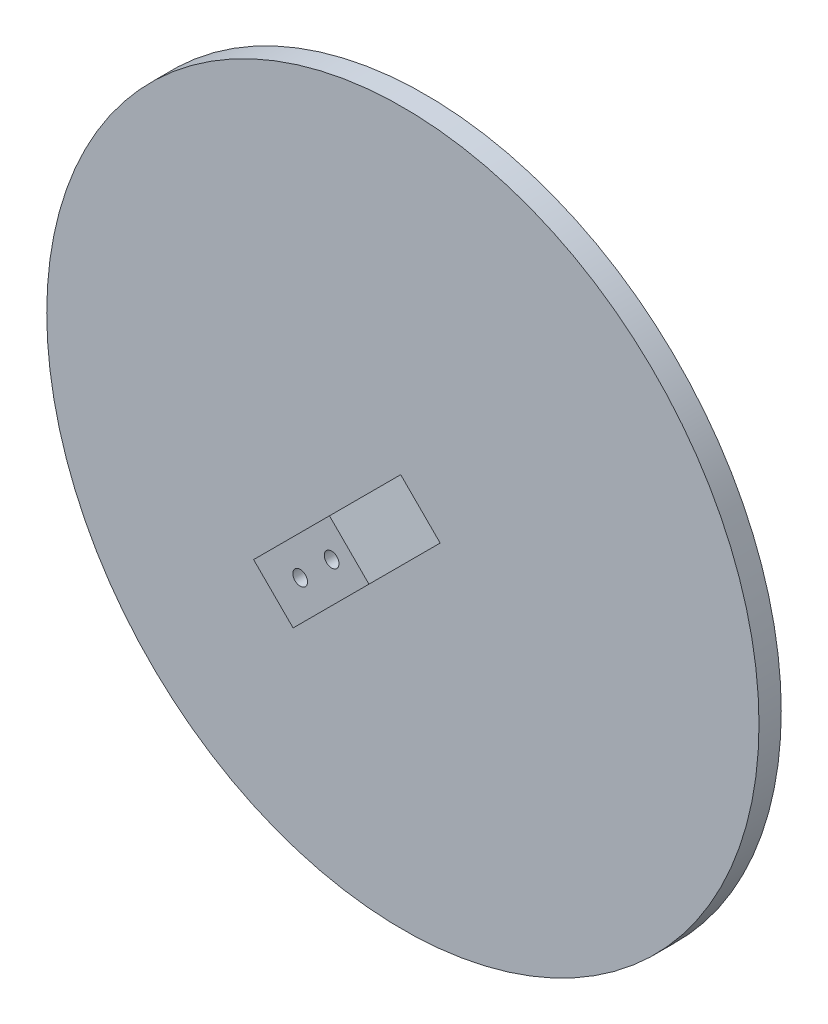
ISO-10303-21;
HEADER;
FILE_DESCRIPTION(('STEP AP214'),'2;1');
FILE_NAME('part.step','',(''),(''),'','','');
FILE_SCHEMA(('AUTOMOTIVE_DESIGN { 1 0 10303 214 1 1 1 1 }'));
ENDSEC;
DATA;
#1=APPLICATION_CONTEXT('core data for automotive mechanical design processes');
#2=APPLICATION_PROTOCOL_DEFINITION('international standard','automotive_design',2000,#1);
#3=PRODUCT_CONTEXT('',#1,'mechanical');
#4=PRODUCT('Part','Part','',(#3));
#5=PRODUCT_RELATED_PRODUCT_CATEGORY('part','',(#4));
#6=PRODUCT_DEFINITION_FORMATION('','',#4);
#7=PRODUCT_DEFINITION_CONTEXT('part definition',#1,'design');
#8=PRODUCT_DEFINITION('design','',#6,#7);
#9=PRODUCT_DEFINITION_SHAPE('','',#8);
#10=(LENGTH_UNIT() NAMED_UNIT(*) SI_UNIT(.MILLI.,.METRE.));
#11=(NAMED_UNIT(*) PLANE_ANGLE_UNIT() SI_UNIT($,.RADIAN.));
#12=(NAMED_UNIT(*) SI_UNIT($,.STERADIAN.) SOLID_ANGLE_UNIT());
#13=UNCERTAINTY_MEASURE_WITH_UNIT(LENGTH_MEASURE(1.E-05),#10,'distance_accuracy_value','');
#14=(GEOMETRIC_REPRESENTATION_CONTEXT(3) GLOBAL_UNCERTAINTY_ASSIGNED_CONTEXT((#13)) GLOBAL_UNIT_ASSIGNED_CONTEXT((#10,
#11,#12)) REPRESENTATION_CONTEXT('',''));
#15=CARTESIAN_POINT('',(0.,0.,0.));
#16=DIRECTION('',(0.,0.,1.));
#17=DIRECTION('',(1.,0.,0.));
#18=AXIS2_PLACEMENT_3D('',#15,#16,#17);
#19=CARTESIAN_POINT('',(119.618145113715,49.8516335152442,-38.6999999999998));
#20=DIRECTION('',(-0.707106781186541,-0.707106781186554,0.));
#21=DIRECTION('',(0.707106781186554,-0.707106781186541,0.));
#22=AXIS2_PLACEMENT_3D('',#19,#20,#21);
#23=PLANE('',#22);
#24=DIRECTION('',(0.707106781186554,-0.707106781186541,0.));
#25=VECTOR('',#24,1.);
#26=CARTESIAN_POINT('',(119.618145113715,49.8516335152442,-22.6999999999998));
#27=LINE('',#26,#25);
#28=CARTESIAN_POINT('',(110.750968028245,58.7188106007139,-22.6999999999999));
#29=VERTEX_POINT('',#28);
#30=CARTESIAN_POINT('',(119.618145113715,49.8516335152442,-22.6999999999998));
#31=VERTEX_POINT('',#30);
#32=EDGE_CURVE('E102',#29,#31,#27,.T.);
#33=ORIENTED_EDGE('',*,*,#32,.T.);
#34=DIRECTION('',(0.,0.,1.));
#35=VECTOR('',#34,1.);
#36=CARTESIAN_POINT('',(119.618145113715,49.8516335152442,-38.6999999999998));
#37=LINE('',#36,#35);
#38=CARTESIAN_POINT('',(119.618145113715,49.8516335152442,-38.6999999999998));
#39=VERTEX_POINT('',#38);
#40=EDGE_CURVE('E11',#39,#31,#37,.T.);
#41=ORIENTED_EDGE('',*,*,#40,.F.);
#42=DIRECTION('',(0.707106781186554,-0.707106781186541,0.));
#43=VECTOR('',#42,1.);
#44=CARTESIAN_POINT('',(119.618145113715,49.8516335152442,-38.6999999999998));
#45=LINE('',#44,#43);
#46=CARTESIAN_POINT('',(110.750968028245,58.7188106007138,-38.6999999999999));
#47=VERTEX_POINT('',#46);
#48=EDGE_CURVE('E85',#47,#39,#45,.T.);
#49=ORIENTED_EDGE('',*,*,#48,.F.);
#50=DIRECTION('',(0.,0.,1.));
#51=VECTOR('',#50,1.);
#52=CARTESIAN_POINT('',(110.750968028245,58.7188106007138,-38.6999999999999));
#53=LINE('',#52,#51);
#54=EDGE_CURVE('E87',#47,#29,#53,.T.);
#55=ORIENTED_EDGE('',*,*,#54,.T.);
#56=EDGE_LOOP('',(#33,#41,#49,#55));
#57=FACE_BOUND('',#56,.T.);
#58=ADVANCED_FACE('F37',(#57),#23,.F.);
#59=CARTESIAN_POINT('',(119.618145113715,49.8516335152442,-38.6999999999998));
#60=DIRECTION('',(-0.707106781186547,0.707106781186547,0.));
#61=DIRECTION('',(-0.707106781186548,-0.707106781186548,0.));
#62=AXIS2_PLACEMENT_3D('',#59,#60,#61);
#63=PLANE('',#62);
#64=DIRECTION('',(-0.707106781186547,-0.707106781186547,0.));
#65=VECTOR('',#64,1.);
#66=CARTESIAN_POINT('',(119.618145113715,49.8516335152442,-22.6999999999998));
#67=LINE('',#66,#65);
#68=CARTESIAN_POINT('',(102.581939836699,32.8154282382288,-22.6999999999998));
#69=VERTEX_POINT('',#68);
#70=EDGE_CURVE('E104',#31,#69,#67,.T.);
#71=ORIENTED_EDGE('',*,*,#70,.T.);
#72=DIRECTION('',(0.,0.,1.));
#73=VECTOR('',#72,1.);
#74=CARTESIAN_POINT('',(102.581939836699,32.8154282382288,-38.6999999999998));
#75=LINE('',#74,#73);
#76=CARTESIAN_POINT('',(102.581939836699,32.8154282382288,-38.6999999999998));
#77=VERTEX_POINT('',#76);
#78=EDGE_CURVE('E45',#77,#69,#75,.T.);
#79=ORIENTED_EDGE('',*,*,#78,.F.);
#80=DIRECTION('',(-0.707106781186547,-0.707106781186547,0.));
#81=VECTOR('',#80,1.);
#82=CARTESIAN_POINT('',(119.618145113715,49.8516335152442,-38.6999999999998));
#83=LINE('',#82,#81);
#84=EDGE_CURVE('E79',#39,#77,#83,.T.);
#85=ORIENTED_EDGE('',*,*,#84,.F.);
#86=ORIENTED_EDGE('',*,*,#40,.T.);
#87=EDGE_LOOP('',(#71,#79,#85,#86));
#88=FACE_BOUND('',#87,.T.);
#89=ADVANCED_FACE('F112',(#88),#63,.F.);
#90=CARTESIAN_POINT('',(102.581939836699,32.8154282382288,-38.6999999999998));
#91=DIRECTION('',(0.707106781186548,0.707106781186547,0.));
#92=DIRECTION('',(-0.707106781186547,0.707106781186548,0.));
#93=AXIS2_PLACEMENT_3D('',#90,#91,#92);
#94=PLANE('',#93);
#95=DIRECTION('',(-0.707106781186547,0.707106781186548,0.));
#96=VECTOR('',#95,1.);
#97=CARTESIAN_POINT('',(102.581939836699,32.8154282382288,-22.6999999999998));
#98=LINE('',#97,#96);
#99=CARTESIAN_POINT('',(93.7147627512295,41.6826053236986,-22.6999999999999));
#100=VERTEX_POINT('',#99);
#101=EDGE_CURVE('E69',#69,#100,#98,.T.);
#102=ORIENTED_EDGE('',*,*,#101,.T.);
#103=DIRECTION('',(0.,0.,1.));
#104=VECTOR('',#103,1.);
#105=CARTESIAN_POINT('',(93.7147627512295,41.6826053236986,-38.6999999999999));
#106=LINE('',#105,#104);
#107=CARTESIAN_POINT('',(93.7147627512295,41.6826053236986,-38.6999999999999));
#108=VERTEX_POINT('',#107);
#109=EDGE_CURVE('E53',#108,#100,#106,.T.);
#110=ORIENTED_EDGE('',*,*,#109,.F.);
#111=DIRECTION('',(-0.707106781186547,0.707106781186548,0.));
#112=VECTOR('',#111,1.);
#113=CARTESIAN_POINT('',(102.581939836699,32.8154282382288,-38.6999999999998));
#114=LINE('',#113,#112);
#115=EDGE_CURVE('E97',#77,#108,#114,.T.);
#116=ORIENTED_EDGE('',*,*,#115,.F.);
#117=ORIENTED_EDGE('',*,*,#78,.T.);
#118=EDGE_LOOP('',(#102,#110,#116,#117));
#119=FACE_BOUND('',#118,.T.);
#120=ADVANCED_FACE('F109',(#119),#94,.F.);
#121=CARTESIAN_POINT('',(110.750968028245,58.7188106007138,-38.6999999999999));
#122=DIRECTION('',(0.707106781186547,-0.707106781186547,0.));
#123=DIRECTION('',(0.707106781186548,0.707106781186548,0.));
#124=AXIS2_PLACEMENT_3D('',#121,#122,#123);
#125=PLANE('',#124);
#126=DIRECTION('',(0.707106781186548,0.707106781186548,0.));
#127=VECTOR('',#126,1.);
#128=CARTESIAN_POINT('',(110.750968028245,58.7188106007139,-22.6999999999999));
#129=LINE('',#128,#127);
#130=EDGE_CURVE('E74',#100,#29,#129,.T.);
#131=ORIENTED_EDGE('',*,*,#130,.T.);
#132=ORIENTED_EDGE('',*,*,#54,.F.);
#133=DIRECTION('',(0.707106781186548,0.707106781186548,0.));
#134=VECTOR('',#133,1.);
#135=CARTESIAN_POINT('',(110.750968028245,58.7188106007138,-38.6999999999999));
#136=LINE('',#135,#134);
#137=EDGE_CURVE('E93',#108,#47,#136,.T.);
#138=ORIENTED_EDGE('',*,*,#137,.F.);
#139=ORIENTED_EDGE('',*,*,#109,.T.);
#140=EDGE_LOOP('',(#131,#132,#138,#139));
#141=FACE_BOUND('',#140,.T.);
#142=ADVANCED_FACE('F92',(#141),#125,.F.);
#143=CARTESIAN_POINT('',(0.,0.,-22.7));
#144=DIRECTION('',(0.,0.,1.));
#145=DIRECTION('',(1.,0.,0.));
#146=AXIS2_PLACEMENT_3D('',#143,#144,#145);
#147=PLANE('',#146);
#148=CARTESIAN_POINT('',(111.238929756654,50.4526742792527,-22.6999999999999));
#149=DIRECTION('',(0.,0.,-1.));
#150=DIRECTION('',(-1.,0.,0.));
#151=AXIS2_PLACEMENT_3D('',#148,#149,#150);
#152=CIRCLE('',#151,1.65);
#153=CARTESIAN_POINT('',(109.588929756654,50.4526742792527,-22.6999999999999));
#154=VERTEX_POINT('',#153);
#155=EDGE_CURVE('E105',#154,#154,#152,.T.);
#156=ORIENTED_EDGE('',*,*,#155,.T.);
#157=EDGE_LOOP('',(#156));
#158=FACE_BOUND('',#157,.T.);
#159=CARTESIAN_POINT('',(104.167861944789,43.3816064673872,-22.6999999999999));
#160=DIRECTION('',(0.,0.,-1.));
#161=DIRECTION('',(-1.,0.,0.));
#162=AXIS2_PLACEMENT_3D('',#159,#160,#161);
#163=CIRCLE('',#162,1.65);
#164=CARTESIAN_POINT('',(102.517861944789,43.3816064673872,-22.6999999999999));
#165=VERTEX_POINT('',#164);
#166=EDGE_CURVE('E156',#165,#165,#163,.T.);
#167=ORIENTED_EDGE('',*,*,#166,.T.);
#168=EDGE_LOOP('',(#167));
#169=FACE_BOUND('',#168,.T.);
#170=ORIENTED_EDGE('',*,*,#32,.F.);
#171=ORIENTED_EDGE('',*,*,#130,.F.);
#172=ORIENTED_EDGE('',*,*,#101,.F.);
#173=ORIENTED_EDGE('',*,*,#70,.F.);
#174=EDGE_LOOP('',(#170,#171,#172,#173));
#175=FACE_BOUND('',#174,.T.);
#176=ADVANCED_FACE('F111',(#158,#169,#175),#147,.T.);
#177=CARTESIAN_POINT('',(104.167861944789,43.3816064673871,-49.6999999999999));
#178=DIRECTION('',(0.,0.,1.));
#179=DIRECTION('',(1.,0.,0.));
#180=AXIS2_PLACEMENT_3D('',#177,#178,#179);
#181=CYLINDRICAL_SURFACE('',#180,1.65);
#182=ORIENTED_EDGE('',*,*,#166,.F.);
#183=EDGE_LOOP('',(#182));
#184=FACE_BOUND('',#183,.T.);
#185=CARTESIAN_POINT('',(104.167861944789,43.3816064673871,-43.6999999999998));
#186=DIRECTION('',(0.,0.,-1.));
#187=DIRECTION('',(-1.,0.,0.));
#188=AXIS2_PLACEMENT_3D('',#185,#186,#187);
#189=CIRCLE('',#188,1.65);
#190=CARTESIAN_POINT('',(102.517861944789,43.3816064673871,-43.6999999999999));
#191=VERTEX_POINT('',#190);
#192=EDGE_CURVE('E152',#191,#191,#189,.T.);
#193=ORIENTED_EDGE('',*,*,#192,.T.);
#194=EDGE_LOOP('',(#193));
#195=FACE_BOUND('',#194,.T.);
#196=ADVANCED_FACE('F124',(#184,#195),#181,.F.);
#197=CARTESIAN_POINT('',(111.238929756654,50.4526742792526,-49.6999999999999));
#198=DIRECTION('',(0.,0.,1.));
#199=DIRECTION('',(1.,0.,0.));
#200=AXIS2_PLACEMENT_3D('',#197,#198,#199);
#201=CYLINDRICAL_SURFACE('',#200,1.65);
#202=ORIENTED_EDGE('',*,*,#155,.F.);
#203=EDGE_LOOP('',(#202));
#204=FACE_BOUND('',#203,.T.);
#205=CARTESIAN_POINT('',(111.238929756654,50.4526742792526,-43.6999999999998));
#206=DIRECTION('',(0.,0.,-1.));
#207=DIRECTION('',(-1.,0.,0.));
#208=AXIS2_PLACEMENT_3D('',#205,#206,#207);
#209=CIRCLE('',#208,1.65);
#210=CARTESIAN_POINT('',(109.588929756654,50.4526742792526,-43.6999999999999));
#211=VERTEX_POINT('',#210);
#212=EDGE_CURVE('E148',#211,#211,#209,.T.);
#213=ORIENTED_EDGE('',*,*,#212,.T.);
#214=EDGE_LOOP('',(#213));
#215=FACE_BOUND('',#214,.T.);
#216=ADVANCED_FACE('F128',(#204,#215),#201,.F.);
#217=CARTESIAN_POINT('',(111.238929756654,50.4526742792526,-43.6999999999998));
#218=DIRECTION('',(0.,0.,-1.));
#219=DIRECTION('',(-1.,0.,0.));
#220=AXIS2_PLACEMENT_3D('',#217,#218,#219);
#221=PLANE('',#220);
#222=ORIENTED_EDGE('',*,*,#212,.F.);
#223=EDGE_LOOP('',(#222));
#224=FACE_BOUND('',#223,.T.);
#225=ORIENTED_EDGE('',*,*,#192,.F.);
#226=EDGE_LOOP('',(#225));
#227=FACE_BOUND('',#226,.T.);
#228=CARTESIAN_POINT('',(111.238929756654,50.4526742792526,-43.6999999999998));
#229=DIRECTION('',(0.,0.,-1.));
#230=DIRECTION('',(-1.,0.,0.));
#231=AXIS2_PLACEMENT_3D('',#228,#229,#230);
#232=CIRCLE('',#231,80.);
#233=CARTESIAN_POINT('',(31.2389297566541,50.4526742792526,-43.7000000000001));
#234=VERTEX_POINT('',#233);
#235=EDGE_CURVE('E155',#234,#234,#232,.T.);
#236=ORIENTED_EDGE('',*,*,#235,.T.);
#237=EDGE_LOOP('',(#236));
#238=FACE_BOUND('',#237,.T.);
#239=ADVANCED_FACE('F132',(#224,#227,#238),#221,.T.);
#240=CARTESIAN_POINT('',(111.238929756654,50.4526742792526,-43.6999999999998));
#241=DIRECTION('',(0.,0.,1.));
#242=DIRECTION('',(1.,0.,0.));
#243=AXIS2_PLACEMENT_3D('',#240,#241,#242);
#244=CYLINDRICAL_SURFACE('',#243,80.);
#245=ORIENTED_EDGE('',*,*,#235,.F.);
#246=EDGE_LOOP('',(#245));
#247=FACE_BOUND('',#246,.T.);
#248=CARTESIAN_POINT('',(111.238929756654,50.4526742792526,-38.6999999999999));
#249=DIRECTION('',(0.,0.,-1.));
#250=DIRECTION('',(-1.,0.,0.));
#251=AXIS2_PLACEMENT_3D('',#248,#249,#250);
#252=CIRCLE('',#251,80.);
#253=CARTESIAN_POINT('',(31.2389297566541,50.4526742792526,-38.7000000000001));
#254=VERTEX_POINT('',#253);
#255=EDGE_CURVE('E157',#254,#254,#252,.T.);
#256=ORIENTED_EDGE('',*,*,#255,.T.);
#257=EDGE_LOOP('',(#256));
#258=FACE_BOUND('',#257,.T.);
#259=ADVANCED_FACE('F134',(#247,#258),#244,.T.);
#260=CARTESIAN_POINT('',(111.238929756654,50.4526742792526,-38.6999999999999));
#261=DIRECTION('',(0.,0.,-1.));
#262=DIRECTION('',(-1.,0.,0.));
#263=AXIS2_PLACEMENT_3D('',#260,#261,#262);
#264=PLANE('',#263);
#265=ORIENTED_EDGE('',*,*,#255,.F.);
#266=EDGE_LOOP('',(#265));
#267=FACE_BOUND('',#266,.T.);
#268=ORIENTED_EDGE('',*,*,#137,.T.);
#269=ORIENTED_EDGE('',*,*,#48,.T.);
#270=ORIENTED_EDGE('',*,*,#84,.T.);
#271=ORIENTED_EDGE('',*,*,#115,.T.);
#272=EDGE_LOOP('',(#268,#269,#270,#271));
#273=FACE_BOUND('',#272,.T.);
#274=ADVANCED_FACE('F96',(#267,#273),#264,.F.);
#275=CLOSED_SHELL('',(#58,#89,#120,#142,#176,#196,#216,#239,#259,#274));
#276=MANIFOLD_SOLID_BREP('B2',#275);
#277=ADVANCED_BREP_SHAPE_REPRESENTATION('',(#18,#276),#14);
#278=SHAPE_DEFINITION_REPRESENTATION(#9,#277);
ENDSEC;
END-ISO-10303-21;
